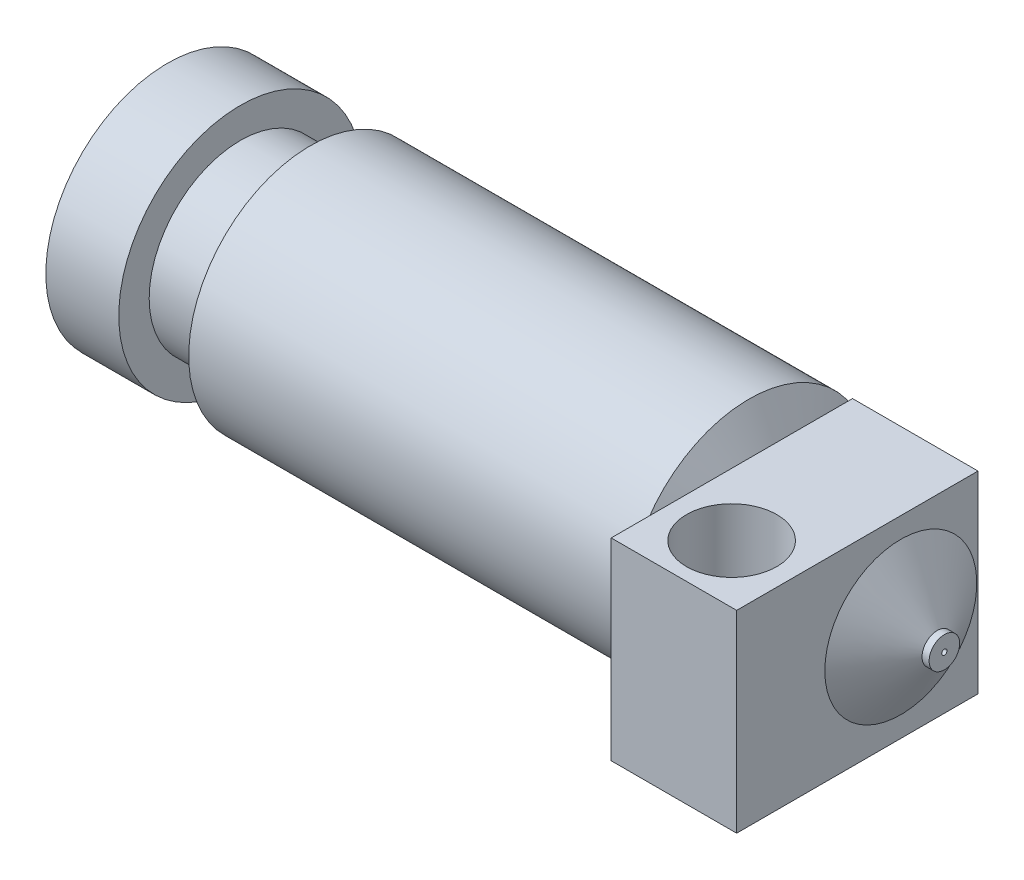
ISO-10303-21;
HEADER;
FILE_DESCRIPTION(('STEP AP214'),'2;1');
FILE_NAME('part.step','',(''),(''),'','','');
FILE_SCHEMA(('AUTOMOTIVE_DESIGN { 1 0 10303 214 1 1 1 1 }'));
ENDSEC;
DATA;
#1=APPLICATION_CONTEXT('core data for automotive mechanical design processes');
#2=APPLICATION_PROTOCOL_DEFINITION('international standard','automotive_design',2000,#1);
#3=PRODUCT_CONTEXT('',#1,'mechanical');
#4=PRODUCT('Part','Part','',(#3));
#5=PRODUCT_RELATED_PRODUCT_CATEGORY('part','',(#4));
#6=PRODUCT_DEFINITION_FORMATION('','',#4);
#7=PRODUCT_DEFINITION_CONTEXT('part definition',#1,'design');
#8=PRODUCT_DEFINITION('design','',#6,#7);
#9=PRODUCT_DEFINITION_SHAPE('','',#8);
#10=(LENGTH_UNIT() NAMED_UNIT(*) SI_UNIT(.MILLI.,.METRE.));
#11=(NAMED_UNIT(*) PLANE_ANGLE_UNIT() SI_UNIT($,.RADIAN.));
#12=(NAMED_UNIT(*) SI_UNIT($,.STERADIAN.) SOLID_ANGLE_UNIT());
#13=UNCERTAINTY_MEASURE_WITH_UNIT(LENGTH_MEASURE(1.E-05),#10,'distance_accuracy_value','');
#14=(GEOMETRIC_REPRESENTATION_CONTEXT(3) GLOBAL_UNCERTAINTY_ASSIGNED_CONTEXT((#13)) GLOBAL_UNIT_ASSIGNED_CONTEXT((#10,
#11,#12)) REPRESENTATION_CONTEXT('',''));
#15=CARTESIAN_POINT('',(0.,0.,0.));
#16=DIRECTION('',(0.,0.,1.));
#17=DIRECTION('',(1.,0.,0.));
#18=AXIS2_PLACEMENT_3D('',#15,#16,#17);
#19=CARTESIAN_POINT('',(-40.,0.,-7.99999999999999));
#20=DIRECTION('',(-1.,0.,0.));
#21=DIRECTION('',(0.,0.,1.));
#22=AXIS2_PLACEMENT_3D('',#19,#20,#21);
#23=PLANE('',#22);
#24=CARTESIAN_POINT('',(-40.,0.,0.));
#25=DIRECTION('',(1.,0.,0.));
#26=DIRECTION('',(0.,0.,-1.));
#27=AXIS2_PLACEMENT_3D('',#24,#25,#26);
#28=CIRCLE('',#27,3.25);
#29=CARTESIAN_POINT('',(-40.,0.,-3.24999999999999));
#30=VERTEX_POINT('',#29);
#31=EDGE_CURVE('E11',#30,#30,#28,.T.);
#32=ORIENTED_EDGE('',*,*,#31,.T.);
#33=EDGE_LOOP('',(#32));
#34=FACE_BOUND('',#33,.T.);
#35=CARTESIAN_POINT('',(-40.,0.,0.));
#36=DIRECTION('',(1.,0.,0.));
#37=DIRECTION('',(0.,0.,-1.));
#38=AXIS2_PLACEMENT_3D('',#35,#36,#37);
#39=CIRCLE('',#38,8.);
#40=CARTESIAN_POINT('',(-40.,0.,-7.99999999999999));
#41=VERTEX_POINT('',#40);
#42=EDGE_CURVE('E112',#41,#41,#39,.T.);
#43=ORIENTED_EDGE('',*,*,#42,.F.);
#44=EDGE_LOOP('',(#43));
#45=FACE_BOUND('',#44,.T.);
#46=ADVANCED_FACE('F32',(#34,#45),#23,.T.);
#47=CARTESIAN_POINT('',(0.,0.,0.));
#48=DIRECTION('',(1.,0.,0.));
#49=DIRECTION('',(0.,0.,-1.));
#50=AXIS2_PLACEMENT_3D('',#47,#48,#49);
#51=CYLINDRICAL_SURFACE('',#50,3.24999999999999);
#52=CARTESIAN_POINT('',(7.2648976381714,0.,0.));
#53=DIRECTION('',(1.,0.,0.));
#54=DIRECTION('',(0.,0.,-1.));
#55=AXIS2_PLACEMENT_3D('',#52,#53,#54);
#56=CIRCLE('',#55,3.24999999999999);
#57=CARTESIAN_POINT('',(7.2648976381714,0.,3.24999999999999));
#58=VERTEX_POINT('',#57);
#59=EDGE_CURVE('E40',#58,#58,#56,.T.);
#60=ORIENTED_EDGE('',*,*,#59,.T.);
#61=EDGE_LOOP('',(#60));
#62=FACE_BOUND('',#61,.T.);
#63=ORIENTED_EDGE('',*,*,#31,.F.);
#64=EDGE_LOOP('',(#63));
#65=FACE_BOUND('',#64,.T.);
#66=ADVANCED_FACE('F147',(#62,#65),#51,.F.);
#67=CARTESIAN_POINT('',(7.2648976381714,0.,0.));
#68=DIRECTION('',(-1.,0.,0.));
#69=DIRECTION('',(0.,0.,1.));
#70=AXIS2_PLACEMENT_3D('',#67,#68,#69);
#71=CONICAL_SURFACE('',#70,3.24999999999999,1.02974425867666);
#72=CARTESIAN_POINT('',(9.11254404168113,0.,0.));
#73=DIRECTION('',(1.,0.,0.));
#74=DIRECTION('',(0.,0.,-1.));
#75=AXIS2_PLACEMENT_3D('',#72,#73,#74);
#76=CIRCLE('',#75,0.175);
#77=CARTESIAN_POINT('',(9.11254404168113,0.,0.174999999999997));
#78=VERTEX_POINT('',#77);
#79=EDGE_CURVE('E142',#78,#78,#76,.T.);
#80=CARTESIAN_POINT('',(9.11254404168113,0.,0.174999999999997));
#81=CARTESIAN_POINT('',(9.09329772497791,0.,0.207031249999997));
#82=CARTESIAN_POINT('',(9.07405140827468,0.,0.239062499999997));
#83=CARTESIAN_POINT('',(9.03555877486823,0.,0.303124999999996));
#84=CARTESIAN_POINT('',(9.016312458165,0.,0.335156249999996));
#85=CARTESIAN_POINT('',(8.97781982475855,0.,0.399218749999996));
#86=CARTESIAN_POINT('',(8.95857350805532,0.,0.431249999999996));
#87=CARTESIAN_POINT('',(8.92008087464887,0.,0.495312499999996));
#88=CARTESIAN_POINT('',(8.90083455794564,0.,0.527343749999996));
#89=CARTESIAN_POINT('',(8.86234192453919,0.,0.591406249999996));
#90=CARTESIAN_POINT('',(8.84309560783596,0.,0.623437499999996));
#91=CARTESIAN_POINT('',(8.80460297442951,0.,0.687499999999996));
#92=CARTESIAN_POINT('',(8.78535665772628,0.,0.719531249999995));
#93=CARTESIAN_POINT('',(8.74686402431983,0.,0.783593749999995));
#94=CARTESIAN_POINT('',(8.72761770761661,0.,0.815624999999996));
#95=CARTESIAN_POINT('',(8.68912507421015,0.,0.879687499999996));
#96=CARTESIAN_POINT('',(8.66987875750693,0.,0.911718749999996));
#97=CARTESIAN_POINT('',(8.63138612410047,0.,0.975781249999995));
#98=CARTESIAN_POINT('',(8.61213980739725,0.,1.0078125));
#99=CARTESIAN_POINT('',(8.57364717399079,0.,1.071875));
#100=CARTESIAN_POINT('',(8.55440085728757,0.,1.10390625));
#101=CARTESIAN_POINT('',(8.51590822388111,0.,1.16796875));
#102=CARTESIAN_POINT('',(8.49666190717789,0.,1.19999999999999));
#103=CARTESIAN_POINT('',(8.45816927377143,0.,1.26406249999999));
#104=CARTESIAN_POINT('',(8.43892295706821,0.,1.29609375));
#105=CARTESIAN_POINT('',(8.40043032366176,0.,1.36015625));
#106=CARTESIAN_POINT('',(8.38118400695853,0.,1.39218749999999));
#107=CARTESIAN_POINT('',(8.34269137355207,0.,1.45624999999999));
#108=CARTESIAN_POINT('',(8.32344505684885,0.,1.48828125));
#109=CARTESIAN_POINT('',(8.2849524234424,0.,1.55234374999999));
#110=CARTESIAN_POINT('',(8.26570610673917,0.,1.58437499999999));
#111=CARTESIAN_POINT('',(8.22721347333272,0.,1.64843749999999));
#112=CARTESIAN_POINT('',(8.20796715662949,0.,1.68046874999999));
#113=CARTESIAN_POINT('',(8.16947452322304,0.,1.74453124999999));
#114=CARTESIAN_POINT('',(8.15022820651981,0.,1.77656249999999));
#115=CARTESIAN_POINT('',(8.11173557311336,0.,1.84062499999999));
#116=CARTESIAN_POINT('',(8.09248925641013,0.,1.87265624999999));
#117=CARTESIAN_POINT('',(8.05399662300368,0.,1.93671874999999));
#118=CARTESIAN_POINT('',(8.03475030630045,0.,1.96874999999999));
#119=CARTESIAN_POINT('',(7.996257672894,0.,2.03281249999999));
#120=CARTESIAN_POINT('',(7.97701135619077,0.,2.06484374999999));
#121=CARTESIAN_POINT('',(7.93851872278432,0.,2.12890624999999));
#122=CARTESIAN_POINT('',(7.9192724060811,0.,2.16093749999999));
#123=CARTESIAN_POINT('',(7.88077977267464,0.,2.22499999999999));
#124=CARTESIAN_POINT('',(7.86153345597142,0.,2.25703124999999));
#125=CARTESIAN_POINT('',(7.82304082256496,0.,2.32109374999999));
#126=CARTESIAN_POINT('',(7.80379450586174,0.,2.35312499999999));
#127=CARTESIAN_POINT('',(7.76530187245528,0.,2.41718749999999));
#128=CARTESIAN_POINT('',(7.74605555575206,0.,2.44921874999999));
#129=CARTESIAN_POINT('',(7.7075629223456,0.,2.51328124999999));
#130=CARTESIAN_POINT('',(7.68831660564238,0.,2.54531249999999));
#131=CARTESIAN_POINT('',(7.64982397223592,0.,2.60937499999999));
#132=CARTESIAN_POINT('',(7.6305776555327,0.,2.64140624999999));
#133=CARTESIAN_POINT('',(7.59208502212625,0.,2.70546874999999));
#134=CARTESIAN_POINT('',(7.57283870542302,0.,2.73749999999999));
#135=CARTESIAN_POINT('',(7.53434607201657,0.,2.80156249999999));
#136=CARTESIAN_POINT('',(7.51509975531334,0.,2.83359374999999));
#137=CARTESIAN_POINT('',(7.47660712190689,0.,2.89765624999999));
#138=CARTESIAN_POINT('',(7.45736080520366,0.,2.92968749999999));
#139=CARTESIAN_POINT('',(7.41886817179721,0.,2.99374999999999));
#140=CARTESIAN_POINT('',(7.39962185509398,0.,3.02578124999999));
#141=CARTESIAN_POINT('',(7.36112922168753,0.,3.08984374999999));
#142=CARTESIAN_POINT('',(7.3418829049843,0.,3.12187499999999));
#143=CARTESIAN_POINT('',(7.30339027157785,0.,3.18593749999999));
#144=CARTESIAN_POINT('',(7.28414395487462,0.,3.21796874999999));
#145=CARTESIAN_POINT('',(7.2648976381714,0.,3.24999999999999));
#146=B_SPLINE_CURVE_WITH_KNOTS('',3,(#80,#81,#82,#83,#84,#85,#86,#87,#88,#89,#90,#91,#92,#93,
#94,#95,#96,#97,#98,#99,#100,#101,#102,#103,#104,#105,#106,#107,#108,#109,#110,#111,#112,#113,
#114,#115,#116,#117,#118,#119,#120,#121,#122,#123,#124,#125,#126,#127,#128,#129,#130,#131,#132,
#133,#134,#135,#136,#137,#138,#139,#140,#141,#142,#143,#144,#145),.UNSPECIFIED.,.F.,.F.,(4,2,2,
2,2,2,2,2,2,2,2,2,2,2,2,2,2,2,2,2,2,2,2,2,2,2,2,2,2,2,2,2,4),(0.,0.112106178013661,
0.224212356027322,0.336318534040981,0.448424712054642,0.560530890068302,0.672637068081963,
0.784743246095623,0.896849424109283,1.00895560212294,1.1210617801366,1.23316795815026,
1.34527413616392,1.45738031417759,1.56948649219125,1.68159267020491,1.79369884821857,
1.90580502623223,2.01791120424589,2.13001738225955,2.24212356027321,2.35422973828687,
2.46633591630053,2.57844209431419,2.69054827232785,2.80265445034151,2.91476062835517,
3.02686680636883,3.13897298438249,3.25107916239615,3.36318534040981,3.47529151842347,
3.58739769643713),.UNSPECIFIED.);
#147=EDGE_CURVE('BSEAM150',#78,#58,#146,.T.);
#148=ORIENTED_EDGE('',*,*,#79,.T.);
#149=ORIENTED_EDGE('',*,*,#59,.F.);
#150=ORIENTED_EDGE('',*,*,#147,.T.);
#151=ORIENTED_EDGE('',*,*,#147,.F.);
#152=EDGE_LOOP('',(#148,#150,#149,#151));
#153=FACE_BOUND('',#152,.T.);
#154=ADVANCED_FACE('F150',(#153),#71,.F.);
#155=CARTESIAN_POINT('',(0.,0.,0.));
#156=DIRECTION('',(1.,0.,0.));
#157=DIRECTION('',(0.,0.,-1.));
#158=AXIS2_PLACEMENT_3D('',#155,#156,#157);
#159=CYLINDRICAL_SURFACE('',#158,0.175);
#160=CARTESIAN_POINT('',(11.122943816837,0.,0.));
#161=DIRECTION('',(1.,0.,0.));
#162=DIRECTION('',(0.,0.,-1.));
#163=AXIS2_PLACEMENT_3D('',#160,#161,#162);
#164=CIRCLE('',#163,0.175);
#165=CARTESIAN_POINT('',(11.122943816837,0.,-0.175000000000001));
#166=VERTEX_POINT('',#165);
#167=EDGE_CURVE('E139',#166,#166,#164,.T.);
#168=ORIENTED_EDGE('',*,*,#167,.T.);
#169=EDGE_LOOP('',(#168));
#170=FACE_BOUND('',#169,.T.);
#171=ORIENTED_EDGE('',*,*,#79,.F.);
#172=EDGE_LOOP('',(#171));
#173=FACE_BOUND('',#172,.T.);
#174=ADVANCED_FACE('F152',(#170,#173),#159,.F.);
#175=CARTESIAN_POINT('',(11.122943816837,0.,-1.005));
#176=DIRECTION('',(1.,0.,0.));
#177=DIRECTION('',(0.,0.,-1.));
#178=AXIS2_PLACEMENT_3D('',#175,#176,#177);
#179=PLANE('',#178);
#180=CARTESIAN_POINT('',(11.122943816837,0.,0.));
#181=DIRECTION('',(1.,0.,0.));
#182=DIRECTION('',(0.,0.,-1.));
#183=AXIS2_PLACEMENT_3D('',#180,#181,#182);
#184=CIRCLE('',#183,1.005);
#185=CARTESIAN_POINT('',(11.122943816837,0.,-1.005));
#186=VERTEX_POINT('',#185);
#187=EDGE_CURVE('E136',#186,#186,#184,.T.);
#188=ORIENTED_EDGE('',*,*,#187,.T.);
#189=EDGE_LOOP('',(#188));
#190=FACE_BOUND('',#189,.T.);
#191=ORIENTED_EDGE('',*,*,#167,.F.);
#192=EDGE_LOOP('',(#191));
#193=FACE_BOUND('',#192,.T.);
#194=ADVANCED_FACE('F159',(#190,#193),#179,.T.);
#195=CARTESIAN_POINT('',(0.,0.,0.));
#196=DIRECTION('',(1.,0.,0.));
#197=DIRECTION('',(0.,0.,-1.));
#198=AXIS2_PLACEMENT_3D('',#195,#196,#197);
#199=CYLINDRICAL_SURFACE('',#198,1.005);
#200=CARTESIAN_POINT('',(10.6554381730151,0.,0.));
#201=DIRECTION('',(1.,0.,0.));
#202=DIRECTION('',(0.,0.,-1.));
#203=AXIS2_PLACEMENT_3D('',#200,#201,#202);
#204=CIRCLE('',#203,1.005);
#205=CARTESIAN_POINT('',(10.6554381730151,0.,1.005));
#206=VERTEX_POINT('',#205);
#207=EDGE_CURVE('E133',#206,#206,#204,.T.);
#208=ORIENTED_EDGE('',*,*,#207,.T.);
#209=EDGE_LOOP('',(#208));
#210=FACE_BOUND('',#209,.T.);
#211=ORIENTED_EDGE('',*,*,#187,.F.);
#212=EDGE_LOOP('',(#211));
#213=FACE_BOUND('',#212,.T.);
#214=ADVANCED_FACE('F236',(#210,#213),#199,.T.);
#215=CARTESIAN_POINT('',(10.6554381730151,0.,0.));
#216=DIRECTION('',(-1.,0.,0.));
#217=DIRECTION('',(0.,0.,1.));
#218=AXIS2_PLACEMENT_3D('',#215,#216,#217);
#219=CONICAL_SURFACE('',#218,1.005,1.02974425867666);
#220=CARTESIAN_POINT('',(8.255,0.,0.));
#221=DIRECTION('',(1.,0.,0.));
#222=DIRECTION('',(0.,0.,-1.));
#223=AXIS2_PLACEMENT_3D('',#220,#221,#222);
#224=CIRCLE('',#223,5.);
#225=CARTESIAN_POINT('',(8.255,0.,5.));
#226=VERTEX_POINT('',#225);
#227=EDGE_CURVE('E109',#226,#226,#224,.F.);
#228=CARTESIAN_POINT('',(8.255,0.,5.));
#229=CARTESIAN_POINT('',(8.28000456430224,0.,4.95838541666667));
#230=CARTESIAN_POINT('',(8.30500912860448,0.,4.91677083333333));
#231=CARTESIAN_POINT('',(8.35501825720896,0.,4.83354166666667));
#232=CARTESIAN_POINT('',(8.3800228215112,0.,4.79192708333333));
#233=CARTESIAN_POINT('',(8.43003195011568,0.,4.70869791666667));
#234=CARTESIAN_POINT('',(8.45503651441792,0.,4.66708333333333));
#235=CARTESIAN_POINT('',(8.50504564302241,0.,4.58385416666667));
#236=CARTESIAN_POINT('',(8.53005020732465,0.,4.54223958333333));
#237=CARTESIAN_POINT('',(8.58005933592913,0.,4.45901041666667));
#238=CARTESIAN_POINT('',(8.60506390023137,0.,4.41739583333333));
#239=CARTESIAN_POINT('',(8.65507302883585,0.,4.33416666666667));
#240=CARTESIAN_POINT('',(8.68007759313809,0.,4.29255208333333));
#241=CARTESIAN_POINT('',(8.73008672174257,0.,4.20932291666667));
#242=CARTESIAN_POINT('',(8.75509128604481,0.,4.16770833333333));
#243=CARTESIAN_POINT('',(8.80510041464929,0.,4.08447916666667));
#244=CARTESIAN_POINT('',(8.83010497895153,0.,4.04286458333333));
#245=CARTESIAN_POINT('',(8.88011410755601,0.,3.95963541666667));
#246=CARTESIAN_POINT('',(8.90511867185825,0.,3.91802083333333));
#247=CARTESIAN_POINT('',(8.95512780046274,0.,3.83479166666667));
#248=CARTESIAN_POINT('',(8.98013236476497,0.,3.79317708333333));
#249=CARTESIAN_POINT('',(9.03014149336946,0.,3.70994791666667));
#250=CARTESIAN_POINT('',(9.0551460576717,0.,3.66833333333333));
#251=CARTESIAN_POINT('',(9.10515518627618,0.,3.58510416666667));
#252=CARTESIAN_POINT('',(9.13015975057842,0.,3.54348958333333));
#253=CARTESIAN_POINT('',(9.1801688791829,0.,3.46026041666667));
#254=CARTESIAN_POINT('',(9.20517344348514,0.,3.41864583333333));
#255=CARTESIAN_POINT('',(9.25518257208962,0.,3.33541666666667));
#256=CARTESIAN_POINT('',(9.28018713639186,0.,3.29380208333333));
#257=CARTESIAN_POINT('',(9.33019626499634,0.,3.21057291666667));
#258=CARTESIAN_POINT('',(9.35520082929858,0.,3.16895833333333));
#259=CARTESIAN_POINT('',(9.40520995790306,0.,3.08572916666667));
#260=CARTESIAN_POINT('',(9.4302145222053,0.,3.04411458333333));
#261=CARTESIAN_POINT('',(9.48022365080979,0.,2.96088541666667));
#262=CARTESIAN_POINT('',(9.50522821511203,0.,2.91927083333333));
#263=CARTESIAN_POINT('',(9.55523734371651,0.,2.83604166666667));
#264=CARTESIAN_POINT('',(9.58024190801875,0.,2.79442708333333));
#265=CARTESIAN_POINT('',(9.63025103662323,0.,2.71119791666667));
#266=CARTESIAN_POINT('',(9.65525560092547,0.,2.66958333333333));
#267=CARTESIAN_POINT('',(9.70526472952995,0.,2.58635416666666));
#268=CARTESIAN_POINT('',(9.73026929383219,0.,2.54473958333333));
#269=CARTESIAN_POINT('',(9.78027842243667,0.,2.46151041666666));
#270=CARTESIAN_POINT('',(9.80528298673891,0.,2.41989583333333));
#271=CARTESIAN_POINT('',(9.85529211534339,0.,2.33666666666666));
#272=CARTESIAN_POINT('',(9.88029667964563,0.,2.29505208333333));
#273=CARTESIAN_POINT('',(9.93030580825011,0.,2.21182291666666));
#274=CARTESIAN_POINT('',(9.95531037255236,0.,2.17020833333333));
#275=CARTESIAN_POINT('',(10.0053195011568,0.,2.08697916666666));
#276=CARTESIAN_POINT('',(10.0303240654591,0.,2.04536458333333));
#277=CARTESIAN_POINT('',(10.0803331940636,0.,1.96213541666666));
#278=CARTESIAN_POINT('',(10.1053377583658,0.,1.92052083333333));
#279=CARTESIAN_POINT('',(10.1553468869703,0.,1.83729166666666));
#280=CARTESIAN_POINT('',(10.1803514512725,0.,1.79567708333333));
#281=CARTESIAN_POINT('',(10.230360579877,0.,1.71244791666666));
#282=CARTESIAN_POINT('',(10.2553651441792,0.,1.67083333333333));
#283=CARTESIAN_POINT('',(10.3053742727837,0.,1.58760416666666));
#284=CARTESIAN_POINT('',(10.330378837086,0.,1.54598958333333));
#285=CARTESIAN_POINT('',(10.3803879656904,0.,1.46276041666666));
#286=CARTESIAN_POINT('',(10.4053925299927,0.,1.42114583333333));
#287=CARTESIAN_POINT('',(10.4554016585972,0.,1.33791666666666));
#288=CARTESIAN_POINT('',(10.4804062228994,0.,1.29630208333333));
#289=CARTESIAN_POINT('',(10.5304153515039,0.,1.21307291666666));
#290=CARTESIAN_POINT('',(10.5554199158061,0.,1.17145833333333));
#291=CARTESIAN_POINT('',(10.6054290444106,0.,1.08822916666666));
#292=CARTESIAN_POINT('',(10.6304336087129,0.,1.04661458333333));
#293=CARTESIAN_POINT('',(10.6554381730151,0.,1.005));
#294=B_SPLINE_CURVE_WITH_KNOTS('',3,(#228,#229,#230,#231,#232,#233,#234,#235,#236,#237,#238,
#239,#240,#241,#242,#243,#244,#245,#246,#247,#248,#249,#250,#251,#252,#253,#254,#255,#256,#257,
#258,#259,#260,#261,#262,#263,#264,#265,#266,#267,#268,#269,#270,#271,#272,#273,#274,#275,#276,
#277,#278,#279,#280,#281,#282,#283,#284,#285,#286,#287,#288,#289,#290,#291,#292,#293),
.UNSPECIFIED.,.F.,.F.,(4,2,2,2,2,2,2,2,2,2,2,2,2,2,2,2,2,2,2,2,2,2,2,2,2,2,2,2,2,2,2,2,4),(0.,
0.145646888183602,0.291293776367204,0.436940664550806,0.582587552734407,0.728234440918007,
0.873881329101609,1.01952821728521,1.16517510546881,1.31082199365241,1.45646888183601,
1.60211577001962,1.74776265820322,1.89340954638682,2.03905643457042,2.18470332275402,
2.33035021093762,2.47599709912122,2.62164398730483,2.76729087548843,2.91293776367203,
3.05858465185563,3.20423154003923,3.34987842822283,3.49552531640643,3.64117220459003,
3.78681909277364,3.93246598095724,4.07811286914084,4.22375975732444,4.36940664550804,
4.51505353369164,4.66070042187524),.UNSPECIFIED.);
#295=EDGE_CURVE('BSEAM203',#226,#206,#294,.T.);
#296=ORIENTED_EDGE('',*,*,#227,.F.);
#297=ORIENTED_EDGE('',*,*,#207,.F.);
#298=ORIENTED_EDGE('',*,*,#295,.T.);
#299=ORIENTED_EDGE('',*,*,#295,.F.);
#300=EDGE_LOOP('',(#296,#298,#297,#299));
#301=FACE_BOUND('',#300,.T.);
#302=ADVANCED_FACE('F203',(#301),#219,.T.);
#303=CARTESIAN_POINT('',(0.,0.,0.));
#304=DIRECTION('',(-1.,0.,0.));
#305=DIRECTION('',(0.,0.,1.));
#306=AXIS2_PLACEMENT_3D('',#303,#304,#305);
#307=CONICAL_SURFACE('',#306,5.,1.0471975511966);
#308=CARTESIAN_POINT('',(-1.73205080756888,0.,0.));
#309=DIRECTION('',(1.,0.,0.));
#310=DIRECTION('',(0.,0.,-1.));
#311=AXIS2_PLACEMENT_3D('',#308,#309,#310);
#312=CIRCLE('',#311,8.);
#313=CARTESIAN_POINT('',(-1.73205080756889,0.,-8.));
#314=VERTEX_POINT('',#313);
#315=EDGE_CURVE('E127',#314,#314,#312,.T.);
#316=ORIENTED_EDGE('',*,*,#315,.T.);
#317=EDGE_LOOP('',(#316));
#318=FACE_BOUND('',#317,.T.);
#319=CARTESIAN_POINT('',(0.,0.,0.));
#320=DIRECTION('',(1.,0.,0.));
#321=DIRECTION('',(0.,0.,-1.));
#322=AXIS2_PLACEMENT_3D('',#319,#320,#321);
#323=CIRCLE('',#322,5.);
#324=CARTESIAN_POINT('',(0.,0.,-5.));
#325=VERTEX_POINT('',#324);
#326=EDGE_CURVE('E130',#325,#325,#323,.T.);
#327=ORIENTED_EDGE('',*,*,#326,.F.);
#328=EDGE_LOOP('',(#327));
#329=FACE_BOUND('',#328,.T.);
#330=ADVANCED_FACE('F197',(#318,#329),#307,.T.);
#331=CARTESIAN_POINT('',(0.,0.,0.));
#332=DIRECTION('',(1.,0.,0.));
#333=DIRECTION('',(0.,0.,-1.));
#334=AXIS2_PLACEMENT_3D('',#331,#332,#333);
#335=CYLINDRICAL_SURFACE('',#334,8.);
#336=CARTESIAN_POINT('',(-30.6,0.,0.));
#337=DIRECTION('',(1.,0.,0.));
#338=DIRECTION('',(0.,0.,-1.));
#339=AXIS2_PLACEMENT_3D('',#336,#337,#338);
#340=CIRCLE('',#339,8.);
#341=CARTESIAN_POINT('',(-30.6,0.,-8.));
#342=VERTEX_POINT('',#341);
#343=EDGE_CURVE('E124',#342,#342,#340,.T.);
#344=ORIENTED_EDGE('',*,*,#343,.T.);
#345=EDGE_LOOP('',(#344));
#346=FACE_BOUND('',#345,.T.);
#347=ORIENTED_EDGE('',*,*,#315,.F.);
#348=EDGE_LOOP('',(#347));
#349=FACE_BOUND('',#348,.T.);
#350=ADVANCED_FACE('F191',(#346,#349),#335,.T.);
#351=CARTESIAN_POINT('',(-30.6,0.,-6.));
#352=DIRECTION('',(-1.,0.,0.));
#353=DIRECTION('',(0.,0.,1.));
#354=AXIS2_PLACEMENT_3D('',#351,#352,#353);
#355=PLANE('',#354);
#356=CARTESIAN_POINT('',(-30.6,0.,0.));
#357=DIRECTION('',(1.,0.,0.));
#358=DIRECTION('',(0.,0.,-1.));
#359=AXIS2_PLACEMENT_3D('',#356,#357,#358);
#360=CIRCLE('',#359,6.);
#361=CARTESIAN_POINT('',(-30.6,0.,-6.));
#362=VERTEX_POINT('',#361);
#363=EDGE_CURVE('E121',#362,#362,#360,.T.);
#364=ORIENTED_EDGE('',*,*,#363,.T.);
#365=EDGE_LOOP('',(#364));
#366=FACE_BOUND('',#365,.T.);
#367=ORIENTED_EDGE('',*,*,#343,.F.);
#368=EDGE_LOOP('',(#367));
#369=FACE_BOUND('',#368,.T.);
#370=ADVANCED_FACE('F185',(#366,#369),#355,.T.);
#371=CARTESIAN_POINT('',(0.,0.,0.));
#372=DIRECTION('',(1.,0.,0.));
#373=DIRECTION('',(0.,0.,-1.));
#374=AXIS2_PLACEMENT_3D('',#371,#372,#373);
#375=CYLINDRICAL_SURFACE('',#374,6.);
#376=CARTESIAN_POINT('',(-35.2,0.,0.));
#377=DIRECTION('',(1.,0.,0.));
#378=DIRECTION('',(0.,0.,-1.));
#379=AXIS2_PLACEMENT_3D('',#376,#377,#378);
#380=CIRCLE('',#379,6.);
#381=CARTESIAN_POINT('',(-35.2,0.,-5.99999999999999));
#382=VERTEX_POINT('',#381);
#383=EDGE_CURVE('E118',#382,#382,#380,.T.);
#384=ORIENTED_EDGE('',*,*,#383,.T.);
#385=EDGE_LOOP('',(#384));
#386=FACE_BOUND('',#385,.T.);
#387=ORIENTED_EDGE('',*,*,#363,.F.);
#388=EDGE_LOOP('',(#387));
#389=FACE_BOUND('',#388,.T.);
#390=ADVANCED_FACE('F179',(#386,#389),#375,.T.);
#391=CARTESIAN_POINT('',(-35.2,0.,-8.));
#392=DIRECTION('',(1.,0.,0.));
#393=DIRECTION('',(0.,0.,-1.));
#394=AXIS2_PLACEMENT_3D('',#391,#392,#393);
#395=PLANE('',#394);
#396=CARTESIAN_POINT('',(-35.2,0.,0.));
#397=DIRECTION('',(1.,0.,0.));
#398=DIRECTION('',(0.,0.,-1.));
#399=AXIS2_PLACEMENT_3D('',#396,#397,#398);
#400=CIRCLE('',#399,8.);
#401=CARTESIAN_POINT('',(-35.2,0.,-8.));
#402=VERTEX_POINT('',#401);
#403=EDGE_CURVE('E115',#402,#402,#400,.T.);
#404=ORIENTED_EDGE('',*,*,#403,.T.);
#405=EDGE_LOOP('',(#404));
#406=FACE_BOUND('',#405,.T.);
#407=ORIENTED_EDGE('',*,*,#383,.F.);
#408=EDGE_LOOP('',(#407));
#409=FACE_BOUND('',#408,.T.);
#410=ADVANCED_FACE('F173',(#406,#409),#395,.T.);
#411=CARTESIAN_POINT('',(0.,0.,0.));
#412=DIRECTION('',(1.,0.,0.));
#413=DIRECTION('',(0.,0.,-1.));
#414=AXIS2_PLACEMENT_3D('',#411,#412,#413);
#415=CYLINDRICAL_SURFACE('',#414,8.);
#416=ORIENTED_EDGE('',*,*,#42,.T.);
#417=EDGE_LOOP('',(#416));
#418=FACE_BOUND('',#417,.T.);
#419=ORIENTED_EDGE('',*,*,#403,.F.);
#420=EDGE_LOOP('',(#419));
#421=FACE_BOUND('',#420,.T.);
#422=ADVANCED_FACE('F170',(#418,#421),#415,.T.);
#423=CARTESIAN_POINT('',(8.255,0.,0.));
#424=DIRECTION('',(1.,0.,0.));
#425=DIRECTION('',(0.,0.,-1.));
#426=AXIS2_PLACEMENT_3D('',#423,#424,#425);
#427=PLANE('',#426);
#428=ORIENTED_EDGE('',*,*,#227,.T.);
#429=EDGE_LOOP('',(#428));
#430=FACE_BOUND('',#429,.T.);
#431=DIRECTION('',(0.,-1.,0.));
#432=VECTOR('',#431,1.);
#433=CARTESIAN_POINT('',(8.255,6.35,10.8));
#434=LINE('',#433,#432);
#435=CARTESIAN_POINT('',(8.255,6.35,10.8));
#436=VERTEX_POINT('',#435);
#437=CARTESIAN_POINT('',(8.255,-6.35,10.8));
#438=VERTEX_POINT('',#437);
#439=EDGE_CURVE('E84',#436,#438,#434,.T.);
#440=ORIENTED_EDGE('',*,*,#439,.T.);
#441=DIRECTION('',(0.,0.,-1.));
#442=VECTOR('',#441,1.);
#443=CARTESIAN_POINT('',(8.255,-6.35,10.8));
#444=LINE('',#443,#442);
#445=CARTESIAN_POINT('',(8.255,-6.35,-5.08));
#446=VERTEX_POINT('',#445);
#447=EDGE_CURVE('E79',#438,#446,#444,.T.);
#448=ORIENTED_EDGE('',*,*,#447,.T.);
#449=DIRECTION('',(0.,1.,0.));
#450=VECTOR('',#449,1.);
#451=CARTESIAN_POINT('',(8.255,6.35,-5.08));
#452=LINE('',#451,#450);
#453=CARTESIAN_POINT('',(8.255,6.35,-5.08));
#454=VERTEX_POINT('',#453);
#455=EDGE_CURVE('E82',#446,#454,#452,.T.);
#456=ORIENTED_EDGE('',*,*,#455,.T.);
#457=DIRECTION('',(0.,0.,1.));
#458=VECTOR('',#457,1.);
#459=CARTESIAN_POINT('',(8.255,6.35,10.8));
#460=LINE('',#459,#458);
#461=EDGE_CURVE('E48',#454,#436,#460,.T.);
#462=ORIENTED_EDGE('',*,*,#461,.T.);
#463=EDGE_LOOP('',(#440,#448,#456,#462));
#464=FACE_BOUND('',#463,.T.);
#465=ADVANCED_FACE('F80',(#430,#464),#427,.T.);
#466=CARTESIAN_POINT('',(0.,0.,0.));
#467=DIRECTION('',(1.,0.,0.));
#468=DIRECTION('',(0.,0.,-1.));
#469=AXIS2_PLACEMENT_3D('',#466,#467,#468);
#470=PLANE('',#469);
#471=ORIENTED_EDGE('',*,*,#326,.T.);
#472=EDGE_LOOP('',(#471));
#473=FACE_BOUND('',#472,.T.);
#474=DIRECTION('',(0.,-1.,0.));
#475=VECTOR('',#474,1.);
#476=CARTESIAN_POINT('',(0.,6.35,10.8));
#477=LINE('',#476,#475);
#478=CARTESIAN_POINT('',(0.,6.35,10.8));
#479=VERTEX_POINT('',#478);
#480=CARTESIAN_POINT('',(0.,-6.35,10.8));
#481=VERTEX_POINT('',#480);
#482=EDGE_CURVE('E99',#479,#481,#477,.T.);
#483=ORIENTED_EDGE('',*,*,#482,.F.);
#484=DIRECTION('',(0.,0.,1.));
#485=VECTOR('',#484,1.);
#486=CARTESIAN_POINT('',(0.,6.35,10.8));
#487=LINE('',#486,#485);
#488=CARTESIAN_POINT('',(0.,6.35,-5.08));
#489=VERTEX_POINT('',#488);
#490=EDGE_CURVE('E71',#489,#479,#487,.T.);
#491=ORIENTED_EDGE('',*,*,#490,.F.);
#492=DIRECTION('',(0.,1.,0.));
#493=VECTOR('',#492,1.);
#494=CARTESIAN_POINT('',(0.,6.35,-5.08));
#495=LINE('',#494,#493);
#496=CARTESIAN_POINT('',(0.,-6.35,-5.08));
#497=VERTEX_POINT('',#496);
#498=EDGE_CURVE('E65',#497,#489,#495,.T.);
#499=ORIENTED_EDGE('',*,*,#498,.F.);
#500=DIRECTION('',(0.,0.,-1.));
#501=VECTOR('',#500,1.);
#502=CARTESIAN_POINT('',(0.,-6.35,10.8));
#503=LINE('',#502,#501);
#504=EDGE_CURVE('E89',#481,#497,#503,.T.);
#505=ORIENTED_EDGE('',*,*,#504,.F.);
#506=EDGE_LOOP('',(#483,#491,#499,#505));
#507=FACE_BOUND('',#506,.T.);
#508=ADVANCED_FACE('F207',(#473,#507),#470,.F.);
#509=CARTESIAN_POINT('',(8.255,6.35,10.8));
#510=DIRECTION('',(0.,0.,-1.));
#511=DIRECTION('',(0.,1.,0.));
#512=AXIS2_PLACEMENT_3D('',#509,#510,#511);
#513=PLANE('',#512);
#514=ORIENTED_EDGE('',*,*,#482,.T.);
#515=DIRECTION('',(-1.,0.,0.));
#516=VECTOR('',#515,1.);
#517=CARTESIAN_POINT('',(8.255,-6.35,10.8));
#518=LINE('',#517,#516);
#519=EDGE_CURVE('E90',#438,#481,#518,.T.);
#520=ORIENTED_EDGE('',*,*,#519,.F.);
#521=ORIENTED_EDGE('',*,*,#439,.F.);
#522=DIRECTION('',(-1.,0.,0.));
#523=VECTOR('',#522,1.);
#524=CARTESIAN_POINT('',(8.255,6.35,10.8));
#525=LINE('',#524,#523);
#526=EDGE_CURVE('E95',#436,#479,#525,.T.);
#527=ORIENTED_EDGE('',*,*,#526,.T.);
#528=EDGE_LOOP('',(#514,#520,#521,#527));
#529=FACE_BOUND('',#528,.T.);
#530=ADVANCED_FACE('F210',(#529),#513,.F.);
#531=CARTESIAN_POINT('',(8.255,-6.35,10.8));
#532=DIRECTION('',(0.,1.,0.));
#533=DIRECTION('',(0.,0.,1.));
#534=AXIS2_PLACEMENT_3D('',#531,#532,#533);
#535=PLANE('',#534);
#536=CARTESIAN_POINT('',(4.115,-6.35,6.99));
#537=DIRECTION('',(0.,1.,0.));
#538=DIRECTION('',(0.,0.,1.));
#539=AXIS2_PLACEMENT_3D('',#536,#537,#538);
#540=CIRCLE('',#539,2.97);
#541=CARTESIAN_POINT('',(4.115,-6.35,9.96));
#542=VERTEX_POINT('',#541);
#543=EDGE_CURVE('E102',#542,#542,#540,.T.);
#544=ORIENTED_EDGE('',*,*,#543,.T.);
#545=EDGE_LOOP('',(#544));
#546=FACE_BOUND('',#545,.T.);
#547=ORIENTED_EDGE('',*,*,#504,.T.);
#548=DIRECTION('',(-1.,0.,0.));
#549=VECTOR('',#548,1.);
#550=CARTESIAN_POINT('',(8.255,-6.35,-5.08));
#551=LINE('',#550,#549);
#552=EDGE_CURVE('E87',#446,#497,#551,.T.);
#553=ORIENTED_EDGE('',*,*,#552,.F.);
#554=ORIENTED_EDGE('',*,*,#447,.F.);
#555=ORIENTED_EDGE('',*,*,#519,.T.);
#556=EDGE_LOOP('',(#547,#553,#554,#555));
#557=FACE_BOUND('',#556,.T.);
#558=ADVANCED_FACE('F88',(#546,#557),#535,.F.);
#559=CARTESIAN_POINT('',(8.255,6.35,-5.08));
#560=DIRECTION('',(0.,0.,1.));
#561=DIRECTION('',(1.,0.,0.));
#562=AXIS2_PLACEMENT_3D('',#559,#560,#561);
#563=PLANE('',#562);
#564=ORIENTED_EDGE('',*,*,#498,.T.);
#565=DIRECTION('',(-1.,0.,0.));
#566=VECTOR('',#565,1.);
#567=CARTESIAN_POINT('',(8.255,6.35,-5.08));
#568=LINE('',#567,#566);
#569=EDGE_CURVE('E91',#454,#489,#568,.T.);
#570=ORIENTED_EDGE('',*,*,#569,.F.);
#571=ORIENTED_EDGE('',*,*,#455,.F.);
#572=ORIENTED_EDGE('',*,*,#552,.T.);
#573=EDGE_LOOP('',(#564,#570,#571,#572));
#574=FACE_BOUND('',#573,.T.);
#575=ADVANCED_FACE('F93',(#574),#563,.F.);
#576=CARTESIAN_POINT('',(8.255,6.35,10.8));
#577=DIRECTION('',(0.,-1.,0.));
#578=DIRECTION('',(0.,0.,-1.));
#579=AXIS2_PLACEMENT_3D('',#576,#577,#578);
#580=PLANE('',#579);
#581=CARTESIAN_POINT('',(4.115,6.35,6.99));
#582=DIRECTION('',(0.,1.,0.));
#583=DIRECTION('',(0.,0.,1.));
#584=AXIS2_PLACEMENT_3D('',#581,#582,#583);
#585=CIRCLE('',#584,2.97);
#586=CARTESIAN_POINT('',(4.115,6.35,9.96));
#587=VERTEX_POINT('',#586);
#588=EDGE_CURVE('E374',#587,#587,#585,.T.);
#589=ORIENTED_EDGE('',*,*,#588,.F.);
#590=EDGE_LOOP('',(#589));
#591=FACE_BOUND('',#590,.T.);
#592=ORIENTED_EDGE('',*,*,#490,.T.);
#593=ORIENTED_EDGE('',*,*,#526,.F.);
#594=ORIENTED_EDGE('',*,*,#461,.F.);
#595=ORIENTED_EDGE('',*,*,#569,.T.);
#596=EDGE_LOOP('',(#592,#593,#594,#595));
#597=FACE_BOUND('',#596,.T.);
#598=ADVANCED_FACE('F214',(#591,#597),#580,.F.);
#599=CARTESIAN_POINT('',(4.115,-8.00000000000001,6.99));
#600=DIRECTION('',(0.,1.,0.));
#601=DIRECTION('',(0.,0.,1.));
#602=AXIS2_PLACEMENT_3D('',#599,#600,#601);
#603=CYLINDRICAL_SURFACE('',#602,2.97);
#604=ORIENTED_EDGE('',*,*,#588,.T.);
#605=EDGE_LOOP('',(#604));
#606=FACE_BOUND('',#605,.T.);
#607=ORIENTED_EDGE('',*,*,#543,.F.);
#608=EDGE_LOOP('',(#607));
#609=FACE_BOUND('',#608,.T.);
#610=ADVANCED_FACE('F216',(#606,#609),#603,.F.);
#611=CLOSED_SHELL('',(#46,#66,#154,#174,#194,#214,#302,#330,#350,#370,#390,#410,#422,#465,#508,
#530,#558,#575,#598,#610));
#612=MANIFOLD_SOLID_BREP('B2',#611);
#613=ADVANCED_BREP_SHAPE_REPRESENTATION('',(#18,#612),#14);
#614=SHAPE_DEFINITION_REPRESENTATION(#9,#613);
ENDSEC;
END-ISO-10303-21;
